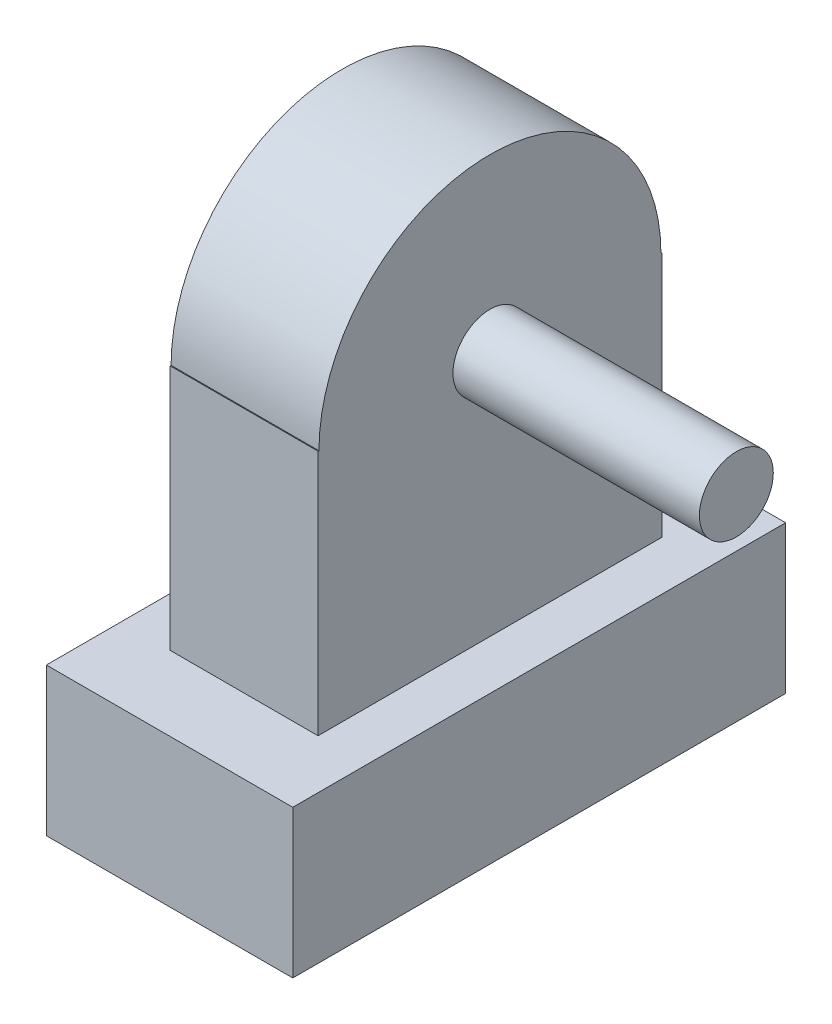
ISO-10303-21;
HEADER;
FILE_DESCRIPTION(('STEP AP214'),'2;1');
FILE_NAME('part.step','',(''),(''),'','','');
FILE_SCHEMA(('AUTOMOTIVE_DESIGN { 1 0 10303 214 1 1 1 1 }'));
ENDSEC;
DATA;
#1=APPLICATION_CONTEXT('core data for automotive mechanical design processes');
#2=APPLICATION_PROTOCOL_DEFINITION('international standard','automotive_design',2000,#1);
#3=PRODUCT_CONTEXT('',#1,'mechanical');
#4=PRODUCT('Part','Part','',(#3));
#5=PRODUCT_RELATED_PRODUCT_CATEGORY('part','',(#4));
#6=PRODUCT_DEFINITION_FORMATION('','',#4);
#7=PRODUCT_DEFINITION_CONTEXT('part definition',#1,'design');
#8=PRODUCT_DEFINITION('design','',#6,#7);
#9=PRODUCT_DEFINITION_SHAPE('','',#8);
#10=(LENGTH_UNIT() NAMED_UNIT(*) SI_UNIT(.MILLI.,.METRE.));
#11=(NAMED_UNIT(*) PLANE_ANGLE_UNIT() SI_UNIT($,.RADIAN.));
#12=(NAMED_UNIT(*) SI_UNIT($,.STERADIAN.) SOLID_ANGLE_UNIT());
#13=UNCERTAINTY_MEASURE_WITH_UNIT(LENGTH_MEASURE(1.E-05),#10,'distance_accuracy_value','');
#14=(GEOMETRIC_REPRESENTATION_CONTEXT(3) GLOBAL_UNCERTAINTY_ASSIGNED_CONTEXT((#13)) GLOBAL_UNIT_ASSIGNED_CONTEXT((#10,
#11,#12)) REPRESENTATION_CONTEXT('',''));
#15=CARTESIAN_POINT('',(0.,0.,0.));
#16=DIRECTION('',(0.,0.,1.));
#17=DIRECTION('',(1.,0.,0.));
#18=AXIS2_PLACEMENT_3D('',#15,#16,#17);
#19=CARTESIAN_POINT('',(0.,80.,0.));
#20=DIRECTION('',(0.,1.,0.));
#21=DIRECTION('',(0.,0.,1.));
#22=AXIS2_PLACEMENT_3D('',#19,#20,#21);
#23=PLANE('',#22);
#24=DIRECTION('',(1.,0.,0.));
#25=VECTOR('',#24,1.);
#26=CARTESIAN_POINT('',(-15.,80.,34.6933908405267));
#27=LINE('',#26,#25);
#28=CARTESIAN_POINT('',(-15.,80.,34.6933908405267));
#29=VERTEX_POINT('',#28);
#30=CARTESIAN_POINT('',(15.,80.,34.6933908405267));
#31=VERTEX_POINT('',#30);
#32=EDGE_CURVE('E48',#29,#31,#27,.T.);
#33=ORIENTED_EDGE('',*,*,#32,.F.);
#34=DIRECTION('',(0.,0.,1.));
#35=VECTOR('',#34,1.);
#36=CARTESIAN_POINT('',(-15.,80.,-34.8709948114266));
#37=LINE('',#36,#35);
#38=CARTESIAN_POINT('',(-15.,80.,34.8709948114266));
#39=VERTEX_POINT('',#38);
#40=EDGE_CURVE('E154',#29,#39,#37,.T.);
#41=ORIENTED_EDGE('',*,*,#40,.T.);
#42=DIRECTION('',(1.,0.,0.));
#43=VECTOR('',#42,1.);
#44=CARTESIAN_POINT('',(-15.,80.,34.8709948114266));
#45=LINE('',#44,#43);
#46=CARTESIAN_POINT('',(15.,80.,34.8709948114266));
#47=VERTEX_POINT('',#46);
#48=EDGE_CURVE('E157',#39,#47,#45,.T.);
#49=ORIENTED_EDGE('',*,*,#48,.T.);
#50=DIRECTION('',(0.,0.,-1.));
#51=VECTOR('',#50,1.);
#52=CARTESIAN_POINT('',(15.,80.,-34.8709948114266));
#53=LINE('',#52,#51);
#54=EDGE_CURVE('E127',#47,#31,#53,.T.);
#55=ORIENTED_EDGE('',*,*,#54,.T.);
#56=EDGE_LOOP('',(#33,#41,#49,#55));
#57=FACE_BOUND('',#56,.T.);
#58=ADVANCED_FACE('F39',(#57),#23,.T.);
#59=CARTESIAN_POINT('',(25.,30.,-50.));
#60=DIRECTION('',(-1.,0.,0.));
#61=DIRECTION('',(0.,0.,1.));
#62=AXIS2_PLACEMENT_3D('',#59,#60,#61);
#63=PLANE('',#62);
#64=DIRECTION('',(0.,0.,-1.));
#65=VECTOR('',#64,1.);
#66=CARTESIAN_POINT('',(25.,0.,-50.));
#67=LINE('',#66,#65);
#68=CARTESIAN_POINT('',(25.,0.,50.));
#69=VERTEX_POINT('',#68);
#70=CARTESIAN_POINT('',(25.,0.,-50.));
#71=VERTEX_POINT('',#70);
#72=EDGE_CURVE('E187',#69,#71,#67,.T.);
#73=ORIENTED_EDGE('',*,*,#72,.T.);
#74=DIRECTION('',(0.,-1.,0.));
#75=VECTOR('',#74,1.);
#76=CARTESIAN_POINT('',(25.,30.,-50.));
#77=LINE('',#76,#75);
#78=CARTESIAN_POINT('',(25.,30.,-50.));
#79=VERTEX_POINT('',#78);
#80=EDGE_CURVE('E136',#79,#71,#77,.T.);
#81=ORIENTED_EDGE('',*,*,#80,.F.);
#82=DIRECTION('',(0.,0.,-1.));
#83=VECTOR('',#82,1.);
#84=CARTESIAN_POINT('',(25.,30.,-50.));
#85=LINE('',#84,#83);
#86=CARTESIAN_POINT('',(25.,30.,50.));
#87=VERTEX_POINT('',#86);
#88=EDGE_CURVE('E188',#87,#79,#85,.T.);
#89=ORIENTED_EDGE('',*,*,#88,.F.);
#90=DIRECTION('',(0.,-1.,0.));
#91=VECTOR('',#90,1.);
#92=CARTESIAN_POINT('',(25.,30.,50.));
#93=LINE('',#92,#91);
#94=EDGE_CURVE('E202',#87,#69,#93,.T.);
#95=ORIENTED_EDGE('',*,*,#94,.T.);
#96=EDGE_LOOP('',(#73,#81,#89,#95));
#97=FACE_BOUND('',#96,.T.);
#98=ADVANCED_FACE('F41',(#97),#63,.F.);
#99=CARTESIAN_POINT('',(-25.,30.,-50.));
#100=DIRECTION('',(0.,0.,1.));
#101=DIRECTION('',(1.,0.,0.));
#102=AXIS2_PLACEMENT_3D('',#99,#100,#101);
#103=PLANE('',#102);
#104=DIRECTION('',(-1.,0.,0.));
#105=VECTOR('',#104,1.);
#106=CARTESIAN_POINT('',(-25.,0.,-50.));
#107=LINE('',#106,#105);
#108=CARTESIAN_POINT('',(-25.,0.,-50.));
#109=VERTEX_POINT('',#108);
#110=EDGE_CURVE('E206',#71,#109,#107,.T.);
#111=ORIENTED_EDGE('',*,*,#110,.T.);
#112=DIRECTION('',(0.,-1.,0.));
#113=VECTOR('',#112,1.);
#114=CARTESIAN_POINT('',(-25.,30.,-50.));
#115=LINE('',#114,#113);
#116=CARTESIAN_POINT('',(-25.,30.,-50.));
#117=VERTEX_POINT('',#116);
#118=EDGE_CURVE('E221',#117,#109,#115,.T.);
#119=ORIENTED_EDGE('',*,*,#118,.F.);
#120=DIRECTION('',(-1.,0.,0.));
#121=VECTOR('',#120,1.);
#122=CARTESIAN_POINT('',(-25.,30.,-50.));
#123=LINE('',#122,#121);
#124=EDGE_CURVE('E192',#79,#117,#123,.T.);
#125=ORIENTED_EDGE('',*,*,#124,.F.);
#126=ORIENTED_EDGE('',*,*,#80,.T.);
#127=EDGE_LOOP('',(#111,#119,#125,#126));
#128=FACE_BOUND('',#127,.T.);
#129=ADVANCED_FACE('F257',(#128),#103,.F.);
#130=CARTESIAN_POINT('',(-25.,30.,-50.));
#131=DIRECTION('',(1.,0.,0.));
#132=DIRECTION('',(0.,0.,-1.));
#133=AXIS2_PLACEMENT_3D('',#130,#131,#132);
#134=PLANE('',#133);
#135=DIRECTION('',(0.,0.,1.));
#136=VECTOR('',#135,1.);
#137=CARTESIAN_POINT('',(-25.,0.,-50.));
#138=LINE('',#137,#136);
#139=CARTESIAN_POINT('',(-25.,0.,50.));
#140=VERTEX_POINT('',#139);
#141=EDGE_CURVE('E209',#109,#140,#138,.T.);
#142=ORIENTED_EDGE('',*,*,#141,.T.);
#143=DIRECTION('',(0.,-1.,0.));
#144=VECTOR('',#143,1.);
#145=CARTESIAN_POINT('',(-25.,30.,50.));
#146=LINE('',#145,#144);
#147=CARTESIAN_POINT('',(-25.,30.,50.));
#148=VERTEX_POINT('',#147);
#149=EDGE_CURVE('E217',#148,#140,#146,.T.);
#150=ORIENTED_EDGE('',*,*,#149,.F.);
#151=DIRECTION('',(0.,0.,1.));
#152=VECTOR('',#151,1.);
#153=CARTESIAN_POINT('',(-25.,30.,-50.));
#154=LINE('',#153,#152);
#155=EDGE_CURVE('E196',#117,#148,#154,.T.);
#156=ORIENTED_EDGE('',*,*,#155,.F.);
#157=ORIENTED_EDGE('',*,*,#118,.T.);
#158=EDGE_LOOP('',(#142,#150,#156,#157));
#159=FACE_BOUND('',#158,.T.);
#160=ADVANCED_FACE('F337',(#159),#134,.F.);
#161=CARTESIAN_POINT('',(-25.,30.,50.));
#162=DIRECTION('',(0.,0.,-1.));
#163=DIRECTION('',(-1.,0.,0.));
#164=AXIS2_PLACEMENT_3D('',#161,#162,#163);
#165=PLANE('',#164);
#166=DIRECTION('',(1.,0.,0.));
#167=VECTOR('',#166,1.);
#168=CARTESIAN_POINT('',(-25.,0.,50.));
#169=LINE('',#168,#167);
#170=EDGE_CURVE('E193',#140,#69,#169,.T.);
#171=ORIENTED_EDGE('',*,*,#170,.T.);
#172=ORIENTED_EDGE('',*,*,#94,.F.);
#173=DIRECTION('',(1.,0.,0.));
#174=VECTOR('',#173,1.);
#175=CARTESIAN_POINT('',(-25.,30.,50.));
#176=LINE('',#175,#174);
#177=EDGE_CURVE('E199',#148,#87,#176,.T.);
#178=ORIENTED_EDGE('',*,*,#177,.F.);
#179=ORIENTED_EDGE('',*,*,#149,.T.);
#180=EDGE_LOOP('',(#171,#172,#178,#179));
#181=FACE_BOUND('',#180,.T.);
#182=ADVANCED_FACE('F331',(#181),#165,.F.);
#183=CARTESIAN_POINT('',(0.,30.,0.));
#184=DIRECTION('',(0.,1.,0.));
#185=DIRECTION('',(0.,0.,1.));
#186=AXIS2_PLACEMENT_3D('',#183,#184,#185);
#187=PLANE('',#186);
#188=DIRECTION('',(0.,0.,-1.));
#189=VECTOR('',#188,1.);
#190=CARTESIAN_POINT('',(15.,30.,-34.8709948114266));
#191=LINE('',#190,#189);
#192=CARTESIAN_POINT('',(15.,30.,34.8709948114266));
#193=VERTEX_POINT('',#192);
#194=CARTESIAN_POINT('',(15.,30.,-34.8709948114266));
#195=VERTEX_POINT('',#194);
#196=EDGE_CURVE('E145',#193,#195,#191,.T.);
#197=ORIENTED_EDGE('',*,*,#196,.F.);
#198=DIRECTION('',(1.,0.,0.));
#199=VECTOR('',#198,1.);
#200=CARTESIAN_POINT('',(-15.,30.,34.8709948114266));
#201=LINE('',#200,#199);
#202=CARTESIAN_POINT('',(-15.,30.,34.8709948114266));
#203=VERTEX_POINT('',#202);
#204=EDGE_CURVE('E128',#203,#193,#201,.T.);
#205=ORIENTED_EDGE('',*,*,#204,.F.);
#206=DIRECTION('',(0.,0.,1.));
#207=VECTOR('',#206,1.);
#208=CARTESIAN_POINT('',(-15.,30.,-34.8709948114266));
#209=LINE('',#208,#207);
#210=CARTESIAN_POINT('',(-15.,30.,-34.8709948114266));
#211=VERTEX_POINT('',#210);
#212=EDGE_CURVE('E167',#211,#203,#209,.T.);
#213=ORIENTED_EDGE('',*,*,#212,.F.);
#214=DIRECTION('',(-1.,0.,0.));
#215=VECTOR('',#214,1.);
#216=CARTESIAN_POINT('',(-15.,30.,-34.8709948114266));
#217=LINE('',#216,#215);
#218=EDGE_CURVE('E163',#195,#211,#217,.T.);
#219=ORIENTED_EDGE('',*,*,#218,.F.);
#220=EDGE_LOOP('',(#197,#205,#213,#219));
#221=FACE_BOUND('',#220,.T.);
#222=ORIENTED_EDGE('',*,*,#88,.T.);
#223=ORIENTED_EDGE('',*,*,#124,.T.);
#224=ORIENTED_EDGE('',*,*,#155,.T.);
#225=ORIENTED_EDGE('',*,*,#177,.T.);
#226=EDGE_LOOP('',(#222,#223,#224,#225));
#227=FACE_BOUND('',#226,.T.);
#228=ADVANCED_FACE('F237',(#221,#227),#187,.T.);
#229=CARTESIAN_POINT('',(0.,0.,0.));
#230=DIRECTION('',(0.,1.,0.));
#231=DIRECTION('',(0.,0.,1.));
#232=AXIS2_PLACEMENT_3D('',#229,#230,#231);
#233=PLANE('',#232);
#234=ORIENTED_EDGE('',*,*,#72,.F.);
#235=ORIENTED_EDGE('',*,*,#170,.F.);
#236=ORIENTED_EDGE('',*,*,#141,.F.);
#237=ORIENTED_EDGE('',*,*,#110,.F.);
#238=EDGE_LOOP('',(#234,#235,#236,#237));
#239=FACE_BOUND('',#238,.T.);
#240=ADVANCED_FACE('F249',(#239),#233,.F.);
#241=CARTESIAN_POINT('',(15.,80.,-34.8709948114266));
#242=DIRECTION('',(-1.,0.,0.));
#243=DIRECTION('',(0.,0.,1.));
#244=AXIS2_PLACEMENT_3D('',#241,#242,#243);
#245=PLANE('',#244);
#246=CARTESIAN_POINT('',(15.,80.,0.));
#247=DIRECTION('',(-1.,0.,0.));
#248=DIRECTION('',(0.,0.,1.));
#249=AXIS2_PLACEMENT_3D('',#246,#247,#248);
#250=CIRCLE('',#249,7.5);
#251=CARTESIAN_POINT('',(15.,80.,7.5));
#252=VERTEX_POINT('',#251);
#253=EDGE_CURVE('E11',#252,#252,#250,.F.);
#254=ORIENTED_EDGE('',*,*,#253,.F.);
#255=EDGE_LOOP('',(#254));
#256=FACE_BOUND('',#255,.T.);
#257=CARTESIAN_POINT('',(15.,80.,-34.6933908405267));
#258=VERTEX_POINT('',#257);
#259=CARTESIAN_POINT('',(15.,80.,-34.8709948114266));
#260=VERTEX_POINT('',#259);
#261=EDGE_CURVE('E117',#258,#260,#53,.T.);
#262=ORIENTED_EDGE('',*,*,#261,.F.);
#263=CARTESIAN_POINT('',(15.,80.,0.));
#264=DIRECTION('',(1.,0.,0.));
#265=DIRECTION('',(0.,0.,-1.));
#266=AXIS2_PLACEMENT_3D('',#263,#264,#265);
#267=CIRCLE('',#266,34.6933908405267);
#268=EDGE_CURVE('E121',#258,#31,#267,.T.);
#269=ORIENTED_EDGE('',*,*,#268,.T.);
#270=ORIENTED_EDGE('',*,*,#54,.F.);
#271=DIRECTION('',(0.,-1.,0.));
#272=VECTOR('',#271,1.);
#273=CARTESIAN_POINT('',(15.,80.,34.8709948114266));
#274=LINE('',#273,#272);
#275=EDGE_CURVE('E160',#47,#193,#274,.T.);
#276=ORIENTED_EDGE('',*,*,#275,.T.);
#277=ORIENTED_EDGE('',*,*,#196,.T.);
#278=DIRECTION('',(0.,-1.,0.));
#279=VECTOR('',#278,1.);
#280=CARTESIAN_POINT('',(15.,80.,-34.8709948114266));
#281=LINE('',#280,#279);
#282=EDGE_CURVE('E124',#260,#195,#281,.T.);
#283=ORIENTED_EDGE('',*,*,#282,.F.);
#284=EDGE_LOOP('',(#262,#269,#270,#276,#277,#283));
#285=FACE_BOUND('',#284,.T.);
#286=ADVANCED_FACE('F118',(#256,#285),#245,.F.);
#287=CARTESIAN_POINT('',(-15.,80.,-34.8709948114266));
#288=DIRECTION('',(0.,0.,1.));
#289=DIRECTION('',(1.,0.,0.));
#290=AXIS2_PLACEMENT_3D('',#287,#288,#289);
#291=PLANE('',#290);
#292=ORIENTED_EDGE('',*,*,#218,.T.);
#293=DIRECTION('',(0.,-1.,0.));
#294=VECTOR('',#293,1.);
#295=CARTESIAN_POINT('',(-15.,80.,-34.8709948114266));
#296=LINE('',#295,#294);
#297=CARTESIAN_POINT('',(-15.,80.,-34.8709948114266));
#298=VERTEX_POINT('',#297);
#299=EDGE_CURVE('E181',#298,#211,#296,.T.);
#300=ORIENTED_EDGE('',*,*,#299,.F.);
#301=DIRECTION('',(-1.,0.,0.));
#302=VECTOR('',#301,1.);
#303=CARTESIAN_POINT('',(-15.,80.,-34.8709948114266));
#304=LINE('',#303,#302);
#305=EDGE_CURVE('E151',#260,#298,#304,.T.);
#306=ORIENTED_EDGE('',*,*,#305,.F.);
#307=ORIENTED_EDGE('',*,*,#282,.T.);
#308=EDGE_LOOP('',(#292,#300,#306,#307));
#309=FACE_BOUND('',#308,.T.);
#310=ADVANCED_FACE('F241',(#309),#291,.F.);
#311=CARTESIAN_POINT('',(-15.,80.,-34.8709948114266));
#312=DIRECTION('',(1.,0.,0.));
#313=DIRECTION('',(0.,0.,-1.));
#314=AXIS2_PLACEMENT_3D('',#311,#312,#313);
#315=PLANE('',#314);
#316=ORIENTED_EDGE('',*,*,#40,.F.);
#317=CARTESIAN_POINT('',(-15.,80.,0.));
#318=DIRECTION('',(1.,0.,0.));
#319=DIRECTION('',(0.,0.,-1.));
#320=AXIS2_PLACEMENT_3D('',#317,#318,#319);
#321=CIRCLE('',#320,34.6933908405267);
#322=CARTESIAN_POINT('',(-15.,80.,-34.6933908405267));
#323=VERTEX_POINT('',#322);
#324=EDGE_CURVE('E140',#323,#29,#321,.T.);
#325=ORIENTED_EDGE('',*,*,#324,.F.);
#326=EDGE_CURVE('E62',#298,#323,#37,.T.);
#327=ORIENTED_EDGE('',*,*,#326,.F.);
#328=ORIENTED_EDGE('',*,*,#299,.T.);
#329=ORIENTED_EDGE('',*,*,#212,.T.);
#330=DIRECTION('',(0.,-1.,0.));
#331=VECTOR('',#330,1.);
#332=CARTESIAN_POINT('',(-15.,80.,34.8709948114266));
#333=LINE('',#332,#331);
#334=EDGE_CURVE('E177',#39,#203,#333,.T.);
#335=ORIENTED_EDGE('',*,*,#334,.F.);
#336=EDGE_LOOP('',(#316,#325,#327,#328,#329,#335));
#337=FACE_BOUND('',#336,.T.);
#338=ADVANCED_FACE('F233',(#337),#315,.F.);
#339=CARTESIAN_POINT('',(-15.,80.,34.8709948114266));
#340=DIRECTION('',(0.,0.,-1.));
#341=DIRECTION('',(-1.,0.,0.));
#342=AXIS2_PLACEMENT_3D('',#339,#340,#341);
#343=PLANE('',#342);
#344=ORIENTED_EDGE('',*,*,#204,.T.);
#345=ORIENTED_EDGE('',*,*,#275,.F.);
#346=ORIENTED_EDGE('',*,*,#48,.F.);
#347=ORIENTED_EDGE('',*,*,#334,.T.);
#348=EDGE_LOOP('',(#344,#345,#346,#347));
#349=FACE_BOUND('',#348,.T.);
#350=ADVANCED_FACE('F235',(#349),#343,.F.);
#351=DIRECTION('',(1.,0.,0.));
#352=VECTOR('',#351,1.);
#353=CARTESIAN_POINT('',(-15.,80.,-34.6933908405267));
#354=LINE('',#353,#352);
#355=EDGE_CURVE('E130',#258,#323,#354,.F.);
#356=ORIENTED_EDGE('',*,*,#355,.F.);
#357=ORIENTED_EDGE('',*,*,#261,.T.);
#358=ORIENTED_EDGE('',*,*,#305,.T.);
#359=ORIENTED_EDGE('',*,*,#326,.T.);
#360=EDGE_LOOP('',(#356,#357,#358,#359));
#361=FACE_BOUND('',#360,.T.);
#362=ADVANCED_FACE('F131',(#361),#23,.T.);
#363=CARTESIAN_POINT('',(-15.,80.,0.));
#364=DIRECTION('',(1.,0.,0.));
#365=DIRECTION('',(0.,0.,-1.));
#366=AXIS2_PLACEMENT_3D('',#363,#364,#365);
#367=CYLINDRICAL_SURFACE('',#366,34.6933908405267);
#368=ORIENTED_EDGE('',*,*,#324,.T.);
#369=ORIENTED_EDGE('',*,*,#32,.T.);
#370=ORIENTED_EDGE('',*,*,#268,.F.);
#371=ORIENTED_EDGE('',*,*,#355,.T.);
#372=EDGE_LOOP('',(#368,#369,#370,#371));
#373=FACE_BOUND('',#372,.T.);
#374=ADVANCED_FACE('F138',(#373),#367,.T.);
#375=CARTESIAN_POINT('',(65.,80.,0.));
#376=DIRECTION('',(-1.,0.,0.));
#377=DIRECTION('',(0.,0.,1.));
#378=AXIS2_PLACEMENT_3D('',#375,#376,#377);
#379=CYLINDRICAL_SURFACE('',#378,7.5);
#380=CARTESIAN_POINT('',(65.,80.,0.));
#381=DIRECTION('',(1.,0.,0.));
#382=DIRECTION('',(0.,0.,-1.));
#383=AXIS2_PLACEMENT_3D('',#380,#381,#382);
#384=CIRCLE('',#383,7.5);
#385=CARTESIAN_POINT('',(65.,80.,-7.50000000000001));
#386=VERTEX_POINT('',#385);
#387=EDGE_CURVE('E141',#386,#386,#384,.T.);
#388=ORIENTED_EDGE('',*,*,#387,.F.);
#389=EDGE_LOOP('',(#388));
#390=FACE_BOUND('',#389,.T.);
#391=ORIENTED_EDGE('',*,*,#253,.T.);
#392=EDGE_LOOP('',(#391));
#393=FACE_BOUND('',#392,.T.);
#394=ADVANCED_FACE('F266',(#390,#393),#379,.T.);
#395=CARTESIAN_POINT('',(65.,80.,0.));
#396=DIRECTION('',(1.,0.,0.));
#397=DIRECTION('',(0.,0.,-1.));
#398=AXIS2_PLACEMENT_3D('',#395,#396,#397);
#399=PLANE('',#398);
#400=ORIENTED_EDGE('',*,*,#387,.T.);
#401=EDGE_LOOP('',(#400));
#402=FACE_BOUND('',#401,.T.);
#403=ADVANCED_FACE('F303',(#402),#399,.T.);
#404=CLOSED_SHELL('',(#58,#98,#129,#160,#182,#228,#240,#286,#310,#338,#350,#362,#374,#394,#403));
#405=MANIFOLD_SOLID_BREP('B2',#404);
#406=ADVANCED_BREP_SHAPE_REPRESENTATION('',(#18,#405),#14);
#407=SHAPE_DEFINITION_REPRESENTATION(#9,#406);
ENDSEC;
END-ISO-10303-21;
